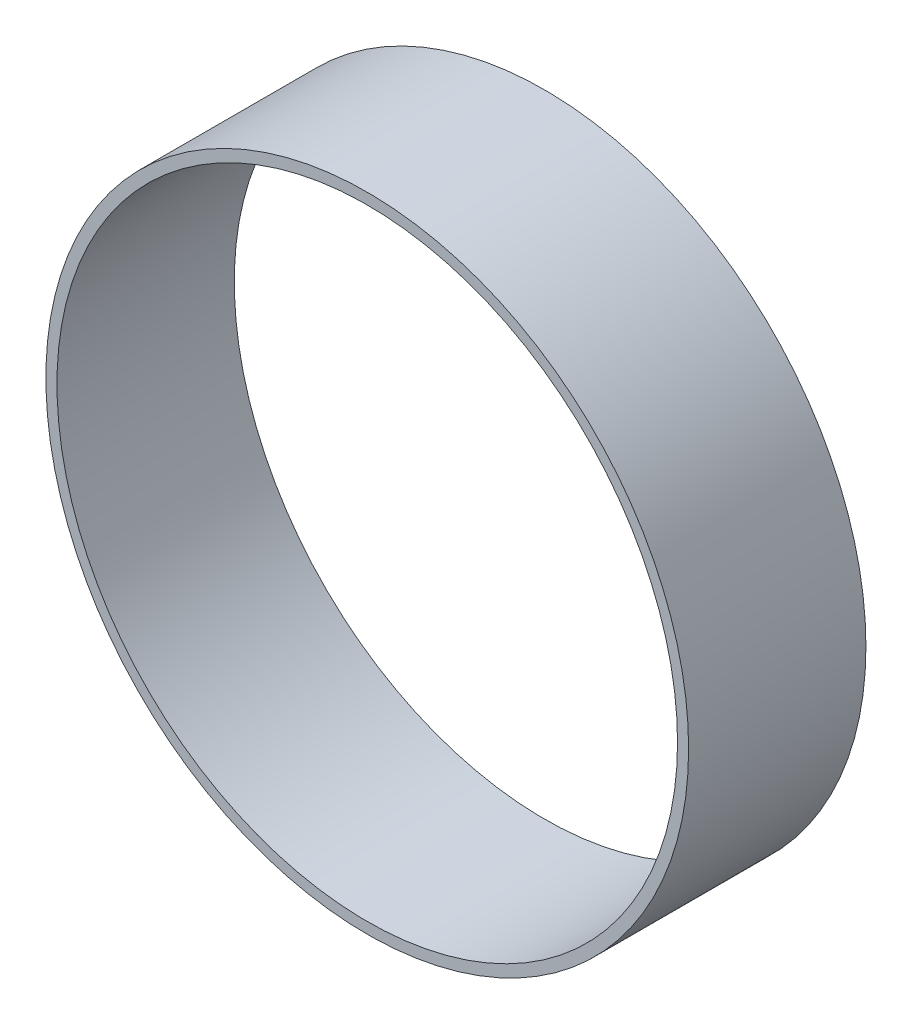
ISO-10303-21;
HEADER;
FILE_DESCRIPTION(('STEP AP214'),'2;1');
FILE_NAME('part.step','',(''),(''),'','','');
FILE_SCHEMA(('AUTOMOTIVE_DESIGN { 1 0 10303 214 1 1 1 1 }'));
ENDSEC;
DATA;
#1=APPLICATION_CONTEXT('core data for automotive mechanical design processes');
#2=APPLICATION_PROTOCOL_DEFINITION('international standard','automotive_design',2000,#1);
#3=PRODUCT_CONTEXT('',#1,'mechanical');
#4=PRODUCT('Part','Part','',(#3));
#5=PRODUCT_RELATED_PRODUCT_CATEGORY('part','',(#4));
#6=PRODUCT_DEFINITION_FORMATION('','',#4);
#7=PRODUCT_DEFINITION_CONTEXT('part definition',#1,'design');
#8=PRODUCT_DEFINITION('design','',#6,#7);
#9=PRODUCT_DEFINITION_SHAPE('','',#8);
#10=(LENGTH_UNIT() NAMED_UNIT(*) SI_UNIT(.MILLI.,.METRE.));
#11=(NAMED_UNIT(*) PLANE_ANGLE_UNIT() SI_UNIT($,.RADIAN.));
#12=(NAMED_UNIT(*) SI_UNIT($,.STERADIAN.) SOLID_ANGLE_UNIT());
#13=UNCERTAINTY_MEASURE_WITH_UNIT(LENGTH_MEASURE(1.E-05),#10,'distance_accuracy_value','');
#14=(GEOMETRIC_REPRESENTATION_CONTEXT(3) GLOBAL_UNCERTAINTY_ASSIGNED_CONTEXT((#13)) GLOBAL_UNIT_ASSIGNED_CONTEXT((#10,
#11,#12)) REPRESENTATION_CONTEXT('',''));
#15=CARTESIAN_POINT('',(0.,0.,0.));
#16=DIRECTION('',(0.,0.,1.));
#17=DIRECTION('',(1.,0.,0.));
#18=AXIS2_PLACEMENT_3D('',#15,#16,#17);
#19=CARTESIAN_POINT('',(0.,0.,40.));
#20=DIRECTION('',(0.,0.,1.));
#21=DIRECTION('',(1.,0.,0.));
#22=AXIS2_PLACEMENT_3D('',#19,#20,#21);
#23=PLANE('',#22);
#24=CARTESIAN_POINT('',(0.,0.,40.));
#25=DIRECTION('',(0.,0.,1.));
#26=DIRECTION('',(1.,0.,0.));
#27=AXIS2_PLACEMENT_3D('',#24,#25,#26);
#28=CIRCLE('',#27,72.5);
#29=CARTESIAN_POINT('',(72.5,0.,40.));
#30=VERTEX_POINT('',#29);
#31=EDGE_CURVE('E10',#30,#30,#28,.T.);
#32=ORIENTED_EDGE('',*,*,#31,.T.);
#33=EDGE_LOOP('',(#32));
#34=FACE_BOUND('',#33,.T.);
#35=CARTESIAN_POINT('',(0.,0.,40.));
#36=DIRECTION('',(0.,0.,1.));
#37=DIRECTION('',(1.,0.,0.));
#38=AXIS2_PLACEMENT_3D('',#35,#36,#37);
#39=CIRCLE('',#38,70.);
#40=CARTESIAN_POINT('',(70.,0.,40.));
#41=VERTEX_POINT('',#40);
#42=EDGE_CURVE('E50',#41,#41,#39,.T.);
#43=ORIENTED_EDGE('',*,*,#42,.F.);
#44=EDGE_LOOP('',(#43));
#45=FACE_BOUND('',#44,.T.);
#46=ADVANCED_FACE('F37',(#34,#45),#23,.T.);
#47=CARTESIAN_POINT('',(0.,0.,0.));
#48=DIRECTION('',(0.,0.,1.));
#49=DIRECTION('',(1.,0.,0.));
#50=AXIS2_PLACEMENT_3D('',#47,#48,#49);
#51=PLANE('',#50);
#52=CARTESIAN_POINT('',(0.,0.,0.));
#53=DIRECTION('',(0.,0.,1.));
#54=DIRECTION('',(1.,0.,0.));
#55=AXIS2_PLACEMENT_3D('',#52,#53,#54);
#56=CIRCLE('',#55,72.5);
#57=CARTESIAN_POINT('',(72.5,0.,0.));
#58=VERTEX_POINT('',#57);
#59=EDGE_CURVE('E41',#58,#58,#56,.T.);
#60=ORIENTED_EDGE('',*,*,#59,.F.);
#61=EDGE_LOOP('',(#60));
#62=FACE_BOUND('',#61,.T.);
#63=CARTESIAN_POINT('',(0.,0.,0.));
#64=DIRECTION('',(0.,0.,1.));
#65=DIRECTION('',(1.,0.,0.));
#66=AXIS2_PLACEMENT_3D('',#63,#64,#65);
#67=CIRCLE('',#66,70.);
#68=CARTESIAN_POINT('',(70.,0.,0.));
#69=VERTEX_POINT('',#68);
#70=EDGE_CURVE('E52',#69,#69,#67,.T.);
#71=ORIENTED_EDGE('',*,*,#70,.T.);
#72=EDGE_LOOP('',(#71));
#73=FACE_BOUND('',#72,.T.);
#74=ADVANCED_FACE('F64',(#62,#73),#51,.F.);
#75=CARTESIAN_POINT('',(0.,0.,40.));
#76=DIRECTION('',(0.,0.,-1.));
#77=DIRECTION('',(-1.,0.,0.));
#78=AXIS2_PLACEMENT_3D('',#75,#76,#77);
#79=CYLINDRICAL_SURFACE('',#78,72.5);
#80=ORIENTED_EDGE('',*,*,#31,.F.);
#81=EDGE_LOOP('',(#80));
#82=FACE_BOUND('',#81,.T.);
#83=ORIENTED_EDGE('',*,*,#59,.T.);
#84=EDGE_LOOP('',(#83));
#85=FACE_BOUND('',#84,.T.);
#86=ADVANCED_FACE('F39',(#82,#85),#79,.T.);
#87=CARTESIAN_POINT('',(0.,0.,40.));
#88=DIRECTION('',(0.,0.,-1.));
#89=DIRECTION('',(-1.,0.,0.));
#90=AXIS2_PLACEMENT_3D('',#87,#88,#89);
#91=CYLINDRICAL_SURFACE('',#90,70.);
#92=ORIENTED_EDGE('',*,*,#42,.T.);
#93=EDGE_LOOP('',(#92));
#94=FACE_BOUND('',#93,.T.);
#95=ORIENTED_EDGE('',*,*,#70,.F.);
#96=EDGE_LOOP('',(#95));
#97=FACE_BOUND('',#96,.T.);
#98=ADVANCED_FACE('F60',(#94,#97),#91,.F.);
#99=CLOSED_SHELL('',(#46,#74,#86,#98));
#100=MANIFOLD_SOLID_BREP('B2',#99);
#101=ADVANCED_BREP_SHAPE_REPRESENTATION('',(#18,#100),#14);
#102=SHAPE_DEFINITION_REPRESENTATION(#9,#101);
ENDSEC;
END-ISO-10303-21;
